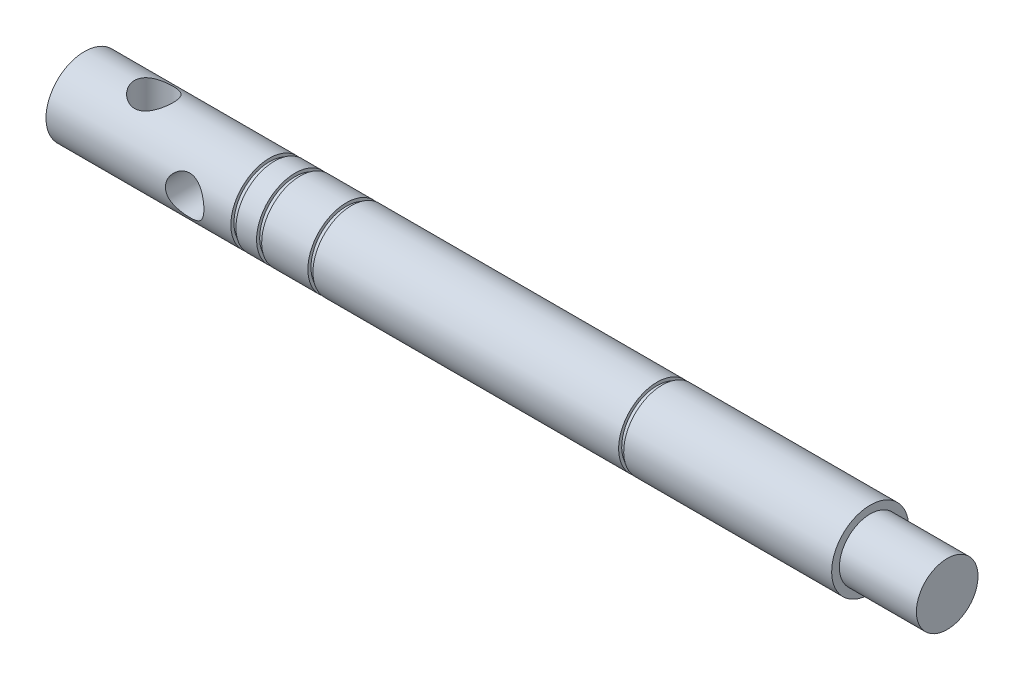
ISO-10303-21;
HEADER;
FILE_DESCRIPTION(('STEP AP214'),'2;1');
FILE_NAME('part.step','',(''),(''),'','','');
FILE_SCHEMA(('AUTOMOTIVE_DESIGN { 1 0 10303 214 1 1 1 1 }'));
ENDSEC;
DATA;
#1=APPLICATION_CONTEXT('core data for automotive mechanical design processes');
#2=APPLICATION_PROTOCOL_DEFINITION('international standard','automotive_design',2000,#1);
#3=PRODUCT_CONTEXT('',#1,'mechanical');
#4=PRODUCT('Part','Part','',(#3));
#5=PRODUCT_RELATED_PRODUCT_CATEGORY('part','',(#4));
#6=PRODUCT_DEFINITION_FORMATION('','',#4);
#7=PRODUCT_DEFINITION_CONTEXT('part definition',#1,'design');
#8=PRODUCT_DEFINITION('design','',#6,#7);
#9=PRODUCT_DEFINITION_SHAPE('','',#8);
#10=(LENGTH_UNIT() NAMED_UNIT(*) SI_UNIT(.MILLI.,.METRE.));
#11=(NAMED_UNIT(*) PLANE_ANGLE_UNIT() SI_UNIT($,.RADIAN.));
#12=(NAMED_UNIT(*) SI_UNIT($,.STERADIAN.) SOLID_ANGLE_UNIT());
#13=UNCERTAINTY_MEASURE_WITH_UNIT(LENGTH_MEASURE(1.E-05),#10,'distance_accuracy_value','');
#14=(GEOMETRIC_REPRESENTATION_CONTEXT(3) GLOBAL_UNCERTAINTY_ASSIGNED_CONTEXT((#13)) GLOBAL_UNIT_ASSIGNED_CONTEXT((#10,
#11,#12)) REPRESENTATION_CONTEXT('',''));
#15=CARTESIAN_POINT('',(0.,0.,0.));
#16=DIRECTION('',(0.,0.,1.));
#17=DIRECTION('',(1.,0.,0.));
#18=AXIS2_PLACEMENT_3D('',#15,#16,#17);
#19=CARTESIAN_POINT('',(0.,0.,0.));
#20=DIRECTION('',(1.,0.,0.));
#21=DIRECTION('',(0.,1.,0.));
#22=AXIS2_PLACEMENT_3D('',#19,#20,#21);
#23=PLANE('',#22);
#24=CARTESIAN_POINT('',(0.,0.,0.));
#25=DIRECTION('',(1.,0.,0.));
#26=DIRECTION('',(0.,1.,0.));
#27=AXIS2_PLACEMENT_3D('',#24,#25,#26);
#28=CIRCLE('',#27,4.);
#29=CARTESIAN_POINT('',(0.,4.,0.));
#30=VERTEX_POINT('',#29);
#31=EDGE_CURVE('E85',#30,#30,#28,.T.);
#32=ORIENTED_EDGE('',*,*,#31,.T.);
#33=EDGE_LOOP('',(#32));
#34=FACE_BOUND('',#33,.T.);
#35=ADVANCED_FACE('F37',(#34),#23,.T.);
#36=CARTESIAN_POINT('',(0.,0.,0.));
#37=DIRECTION('',(1.,0.,0.));
#38=DIRECTION('',(0.,1.,0.));
#39=AXIS2_PLACEMENT_3D('',#36,#37,#38);
#40=CYLINDRICAL_SURFACE('',#39,4.);
#41=CARTESIAN_POINT('',(-10.,0.,0.));
#42=DIRECTION('',(1.,0.,0.));
#43=DIRECTION('',(0.,1.,0.));
#44=AXIS2_PLACEMENT_3D('',#41,#42,#43);
#45=CIRCLE('',#44,4.);
#46=CARTESIAN_POINT('',(-10.,4.,0.));
#47=VERTEX_POINT('',#46);
#48=EDGE_CURVE('E88',#47,#47,#45,.T.);
#49=ORIENTED_EDGE('',*,*,#48,.T.);
#50=EDGE_LOOP('',(#49));
#51=FACE_BOUND('',#50,.T.);
#52=ORIENTED_EDGE('',*,*,#31,.F.);
#53=EDGE_LOOP('',(#52));
#54=FACE_BOUND('',#53,.T.);
#55=ADVANCED_FACE('F155',(#51,#54),#40,.T.);
#56=CARTESIAN_POINT('',(-10.,4.,0.));
#57=DIRECTION('',(1.,0.,0.));
#58=DIRECTION('',(0.,1.,0.));
#59=AXIS2_PLACEMENT_3D('',#56,#57,#58);
#60=PLANE('',#59);
#61=CARTESIAN_POINT('',(-10.,0.,0.));
#62=DIRECTION('',(1.,0.,0.));
#63=DIRECTION('',(0.,1.,0.));
#64=AXIS2_PLACEMENT_3D('',#61,#62,#63);
#65=CIRCLE('',#64,5.);
#66=CARTESIAN_POINT('',(-10.,5.,0.));
#67=VERTEX_POINT('',#66);
#68=EDGE_CURVE('E91',#67,#67,#65,.T.);
#69=ORIENTED_EDGE('',*,*,#68,.T.);
#70=EDGE_LOOP('',(#69));
#71=FACE_BOUND('',#70,.T.);
#72=ORIENTED_EDGE('',*,*,#48,.F.);
#73=EDGE_LOOP('',(#72));
#74=FACE_BOUND('',#73,.T.);
#75=ADVANCED_FACE('F160',(#71,#74),#60,.T.);
#76=CARTESIAN_POINT('',(0.,0.,0.));
#77=DIRECTION('',(1.,0.,0.));
#78=DIRECTION('',(0.,1.,0.));
#79=AXIS2_PLACEMENT_3D('',#76,#77,#78);
#80=CYLINDRICAL_SURFACE('',#79,5.);
#81=CARTESIAN_POINT('',(-37.,0.,0.));
#82=DIRECTION('',(1.,0.,0.));
#83=DIRECTION('',(0.,1.,0.));
#84=AXIS2_PLACEMENT_3D('',#81,#82,#83);
#85=CIRCLE('',#84,5.);
#86=CARTESIAN_POINT('',(-37.,5.,0.));
#87=VERTEX_POINT('',#86);
#88=EDGE_CURVE('E94',#87,#87,#85,.T.);
#89=ORIENTED_EDGE('',*,*,#88,.T.);
#90=EDGE_LOOP('',(#89));
#91=FACE_BOUND('',#90,.T.);
#92=ORIENTED_EDGE('',*,*,#68,.F.);
#93=EDGE_LOOP('',(#92));
#94=FACE_BOUND('',#93,.T.);
#95=ADVANCED_FACE('F167',(#91,#94),#80,.T.);
#96=CARTESIAN_POINT('',(-37.,5.,0.));
#97=DIRECTION('',(-1.,0.,0.));
#98=DIRECTION('',(0.,-1.,0.));
#99=AXIS2_PLACEMENT_3D('',#96,#97,#98);
#100=PLANE('',#99);
#101=CARTESIAN_POINT('',(-37.,0.,0.));
#102=DIRECTION('',(1.,0.,0.));
#103=DIRECTION('',(0.,1.,0.));
#104=AXIS2_PLACEMENT_3D('',#101,#102,#103);
#105=CIRCLE('',#104,4.6);
#106=CARTESIAN_POINT('',(-37.,4.59999999999999,0.));
#107=VERTEX_POINT('',#106);
#108=EDGE_CURVE('E97',#107,#107,#105,.T.);
#109=ORIENTED_EDGE('',*,*,#108,.T.);
#110=EDGE_LOOP('',(#109));
#111=FACE_BOUND('',#110,.T.);
#112=ORIENTED_EDGE('',*,*,#88,.F.);
#113=EDGE_LOOP('',(#112));
#114=FACE_BOUND('',#113,.T.);
#115=ADVANCED_FACE('F173',(#111,#114),#100,.T.);
#116=CARTESIAN_POINT('',(0.,0.,0.));
#117=DIRECTION('',(1.,0.,0.));
#118=DIRECTION('',(0.,1.,0.));
#119=AXIS2_PLACEMENT_3D('',#116,#117,#118);
#120=CYLINDRICAL_SURFACE('',#119,4.6);
#121=CARTESIAN_POINT('',(-37.66,0.,0.));
#122=DIRECTION('',(1.,0.,0.));
#123=DIRECTION('',(0.,1.,0.));
#124=AXIS2_PLACEMENT_3D('',#121,#122,#123);
#125=CIRCLE('',#124,4.6);
#126=CARTESIAN_POINT('',(-37.66,4.6,0.));
#127=VERTEX_POINT('',#126);
#128=EDGE_CURVE('E100',#127,#127,#125,.T.);
#129=ORIENTED_EDGE('',*,*,#128,.T.);
#130=EDGE_LOOP('',(#129));
#131=FACE_BOUND('',#130,.T.);
#132=ORIENTED_EDGE('',*,*,#108,.F.);
#133=EDGE_LOOP('',(#132));
#134=FACE_BOUND('',#133,.T.);
#135=ADVANCED_FACE('F177',(#131,#134),#120,.T.);
#136=CARTESIAN_POINT('',(-37.66,4.6,0.));
#137=DIRECTION('',(1.,0.,0.));
#138=DIRECTION('',(0.,1.,0.));
#139=AXIS2_PLACEMENT_3D('',#136,#137,#138);
#140=PLANE('',#139);
#141=CARTESIAN_POINT('',(-37.66,0.,0.));
#142=DIRECTION('',(1.,0.,0.));
#143=DIRECTION('',(0.,1.,0.));
#144=AXIS2_PLACEMENT_3D('',#141,#142,#143);
#145=CIRCLE('',#144,5.);
#146=CARTESIAN_POINT('',(-37.66,5.,0.));
#147=VERTEX_POINT('',#146);
#148=EDGE_CURVE('E103',#147,#147,#145,.T.);
#149=ORIENTED_EDGE('',*,*,#148,.T.);
#150=EDGE_LOOP('',(#149));
#151=FACE_BOUND('',#150,.T.);
#152=ORIENTED_EDGE('',*,*,#128,.F.);
#153=EDGE_LOOP('',(#152));
#154=FACE_BOUND('',#153,.T.);
#155=ADVANCED_FACE('F181',(#151,#154),#140,.T.);
#156=CARTESIAN_POINT('',(0.,0.,0.));
#157=DIRECTION('',(1.,0.,0.));
#158=DIRECTION('',(0.,1.,0.));
#159=AXIS2_PLACEMENT_3D('',#156,#157,#158);
#160=CYLINDRICAL_SURFACE('',#159,5.);
#161=CARTESIAN_POINT('',(-77.34,0.,0.));
#162=DIRECTION('',(1.,0.,0.));
#163=DIRECTION('',(0.,1.,0.));
#164=AXIS2_PLACEMENT_3D('',#161,#162,#163);
#165=CIRCLE('',#164,5.);
#166=CARTESIAN_POINT('',(-77.34,4.99999999999999,0.));
#167=VERTEX_POINT('',#166);
#168=EDGE_CURVE('E106',#167,#167,#165,.T.);
#169=ORIENTED_EDGE('',*,*,#168,.T.);
#170=EDGE_LOOP('',(#169));
#171=FACE_BOUND('',#170,.T.);
#172=ORIENTED_EDGE('',*,*,#148,.F.);
#173=EDGE_LOOP('',(#172));
#174=FACE_BOUND('',#173,.T.);
#175=ADVANCED_FACE('F185',(#171,#174),#160,.T.);
#176=CARTESIAN_POINT('',(-77.34,4.59999999999999,0.));
#177=DIRECTION('',(-1.,0.,0.));
#178=DIRECTION('',(0.,-1.,0.));
#179=AXIS2_PLACEMENT_3D('',#176,#177,#178);
#180=PLANE('',#179);
#181=CARTESIAN_POINT('',(-77.34,0.,0.));
#182=DIRECTION('',(1.,0.,0.));
#183=DIRECTION('',(0.,1.,0.));
#184=AXIS2_PLACEMENT_3D('',#181,#182,#183);
#185=CIRCLE('',#184,4.6);
#186=CARTESIAN_POINT('',(-77.34,4.59999999999999,0.));
#187=VERTEX_POINT('',#186);
#188=EDGE_CURVE('E109',#187,#187,#185,.T.);
#189=ORIENTED_EDGE('',*,*,#188,.T.);
#190=EDGE_LOOP('',(#189));
#191=FACE_BOUND('',#190,.T.);
#192=ORIENTED_EDGE('',*,*,#168,.F.);
#193=EDGE_LOOP('',(#192));
#194=FACE_BOUND('',#193,.T.);
#195=ADVANCED_FACE('F189',(#191,#194),#180,.T.);
#196=CARTESIAN_POINT('',(0.,0.,0.));
#197=DIRECTION('',(1.,0.,0.));
#198=DIRECTION('',(0.,1.,0.));
#199=AXIS2_PLACEMENT_3D('',#196,#197,#198);
#200=CYLINDRICAL_SURFACE('',#199,4.6);
#201=CARTESIAN_POINT('',(-78.,0.,0.));
#202=DIRECTION('',(1.,0.,0.));
#203=DIRECTION('',(0.,1.,0.));
#204=AXIS2_PLACEMENT_3D('',#201,#202,#203);
#205=CIRCLE('',#204,4.6);
#206=CARTESIAN_POINT('',(-78.,4.59999999999999,0.));
#207=VERTEX_POINT('',#206);
#208=EDGE_CURVE('E112',#207,#207,#205,.T.);
#209=ORIENTED_EDGE('',*,*,#208,.T.);
#210=EDGE_LOOP('',(#209));
#211=FACE_BOUND('',#210,.T.);
#212=ORIENTED_EDGE('',*,*,#188,.F.);
#213=EDGE_LOOP('',(#212));
#214=FACE_BOUND('',#213,.T.);
#215=ADVANCED_FACE('F193',(#211,#214),#200,.T.);
#216=CARTESIAN_POINT('',(-78.,4.99999999999999,0.));
#217=DIRECTION('',(1.,0.,0.));
#218=DIRECTION('',(0.,1.,0.));
#219=AXIS2_PLACEMENT_3D('',#216,#217,#218);
#220=PLANE('',#219);
#221=CARTESIAN_POINT('',(-78.,0.,0.));
#222=DIRECTION('',(1.,0.,0.));
#223=DIRECTION('',(0.,1.,0.));
#224=AXIS2_PLACEMENT_3D('',#221,#222,#223);
#225=CIRCLE('',#224,5.);
#226=CARTESIAN_POINT('',(-78.,4.99999999999999,0.));
#227=VERTEX_POINT('',#226);
#228=EDGE_CURVE('E115',#227,#227,#225,.T.);
#229=ORIENTED_EDGE('',*,*,#228,.T.);
#230=EDGE_LOOP('',(#229));
#231=FACE_BOUND('',#230,.T.);
#232=ORIENTED_EDGE('',*,*,#208,.F.);
#233=EDGE_LOOP('',(#232));
#234=FACE_BOUND('',#233,.T.);
#235=ADVANCED_FACE('F197',(#231,#234),#220,.T.);
#236=CARTESIAN_POINT('',(0.,0.,0.));
#237=DIRECTION('',(1.,0.,0.));
#238=DIRECTION('',(0.,1.,0.));
#239=AXIS2_PLACEMENT_3D('',#236,#237,#238);
#240=CYLINDRICAL_SURFACE('',#239,5.);
#241=CARTESIAN_POINT('',(-84.,0.,0.));
#242=DIRECTION('',(1.,0.,0.));
#243=DIRECTION('',(0.,1.,0.));
#244=AXIS2_PLACEMENT_3D('',#241,#242,#243);
#245=CIRCLE('',#244,5.);
#246=CARTESIAN_POINT('',(-84.,4.99999999999999,0.));
#247=VERTEX_POINT('',#246);
#248=EDGE_CURVE('E118',#247,#247,#245,.T.);
#249=ORIENTED_EDGE('',*,*,#248,.T.);
#250=EDGE_LOOP('',(#249));
#251=FACE_BOUND('',#250,.T.);
#252=ORIENTED_EDGE('',*,*,#228,.F.);
#253=EDGE_LOOP('',(#252));
#254=FACE_BOUND('',#253,.T.);
#255=ADVANCED_FACE('F201',(#251,#254),#240,.T.);
#256=CARTESIAN_POINT('',(-84.,4.99999999999999,0.));
#257=DIRECTION('',(-1.,0.,0.));
#258=DIRECTION('',(0.,-1.,0.));
#259=AXIS2_PLACEMENT_3D('',#256,#257,#258);
#260=PLANE('',#259);
#261=CARTESIAN_POINT('',(-84.,0.,0.));
#262=DIRECTION('',(1.,0.,0.));
#263=DIRECTION('',(0.,1.,0.));
#264=AXIS2_PLACEMENT_3D('',#261,#262,#263);
#265=CIRCLE('',#264,4.60000000000003);
#266=CARTESIAN_POINT('',(-84.,4.60000000000002,0.));
#267=VERTEX_POINT('',#266);
#268=EDGE_CURVE('E121',#267,#267,#265,.T.);
#269=ORIENTED_EDGE('',*,*,#268,.T.);
#270=EDGE_LOOP('',(#269));
#271=FACE_BOUND('',#270,.T.);
#272=ORIENTED_EDGE('',*,*,#248,.F.);
#273=EDGE_LOOP('',(#272));
#274=FACE_BOUND('',#273,.T.);
#275=ADVANCED_FACE('F205',(#271,#274),#260,.T.);
#276=CARTESIAN_POINT('',(0.,0.,0.));
#277=DIRECTION('',(1.,0.,0.));
#278=DIRECTION('',(0.,1.,0.));
#279=AXIS2_PLACEMENT_3D('',#276,#277,#278);
#280=CYLINDRICAL_SURFACE('',#279,4.60000000000003);
#281=CARTESIAN_POINT('',(-84.66,0.,0.));
#282=DIRECTION('',(1.,0.,0.));
#283=DIRECTION('',(0.,1.,0.));
#284=AXIS2_PLACEMENT_3D('',#281,#282,#283);
#285=CIRCLE('',#284,4.60000000000003);
#286=CARTESIAN_POINT('',(-84.66,4.60000000000002,0.));
#287=VERTEX_POINT('',#286);
#288=EDGE_CURVE('E124',#287,#287,#285,.T.);
#289=ORIENTED_EDGE('',*,*,#288,.T.);
#290=EDGE_LOOP('',(#289));
#291=FACE_BOUND('',#290,.T.);
#292=ORIENTED_EDGE('',*,*,#268,.F.);
#293=EDGE_LOOP('',(#292));
#294=FACE_BOUND('',#293,.T.);
#295=ADVANCED_FACE('F209',(#291,#294),#280,.T.);
#296=CARTESIAN_POINT('',(-84.66,4.60000000000002,0.));
#297=DIRECTION('',(1.,0.,0.));
#298=DIRECTION('',(0.,1.,0.));
#299=AXIS2_PLACEMENT_3D('',#296,#297,#298);
#300=PLANE('',#299);
#301=CARTESIAN_POINT('',(-84.66,0.,0.));
#302=DIRECTION('',(1.,0.,0.));
#303=DIRECTION('',(0.,1.,0.));
#304=AXIS2_PLACEMENT_3D('',#301,#302,#303);
#305=CIRCLE('',#304,5.00000000000003);
#306=CARTESIAN_POINT('',(-84.66,5.00000000000002,0.));
#307=VERTEX_POINT('',#306);
#308=EDGE_CURVE('E127',#307,#307,#305,.T.);
#309=ORIENTED_EDGE('',*,*,#308,.T.);
#310=EDGE_LOOP('',(#309));
#311=FACE_BOUND('',#310,.T.);
#312=ORIENTED_EDGE('',*,*,#288,.F.);
#313=EDGE_LOOP('',(#312));
#314=FACE_BOUND('',#313,.T.);
#315=ADVANCED_FACE('F213',(#311,#314),#300,.T.);
#316=CARTESIAN_POINT('',(0.,0.,0.));
#317=DIRECTION('',(1.,0.,0.));
#318=DIRECTION('',(0.,1.,0.));
#319=AXIS2_PLACEMENT_3D('',#316,#317,#318);
#320=CYLINDRICAL_SURFACE('',#319,5.00000000000003);
#321=CARTESIAN_POINT('',(-87.34,0.,0.));
#322=DIRECTION('',(1.,0.,0.));
#323=DIRECTION('',(0.,1.,0.));
#324=AXIS2_PLACEMENT_3D('',#321,#322,#323);
#325=CIRCLE('',#324,5.00000000000003);
#326=CARTESIAN_POINT('',(-87.34,5.00000000000002,0.));
#327=VERTEX_POINT('',#326);
#328=EDGE_CURVE('E130',#327,#327,#325,.T.);
#329=ORIENTED_EDGE('',*,*,#328,.T.);
#330=EDGE_LOOP('',(#329));
#331=FACE_BOUND('',#330,.T.);
#332=ORIENTED_EDGE('',*,*,#308,.F.);
#333=EDGE_LOOP('',(#332));
#334=FACE_BOUND('',#333,.T.);
#335=ADVANCED_FACE('F217',(#331,#334),#320,.T.);
#336=CARTESIAN_POINT('',(-87.34,5.00000000000002,0.));
#337=DIRECTION('',(-1.,0.,0.));
#338=DIRECTION('',(0.,-1.,0.));
#339=AXIS2_PLACEMENT_3D('',#336,#337,#338);
#340=PLANE('',#339);
#341=CARTESIAN_POINT('',(-87.34,0.,0.));
#342=DIRECTION('',(1.,0.,0.));
#343=DIRECTION('',(0.,1.,0.));
#344=AXIS2_PLACEMENT_3D('',#341,#342,#343);
#345=CIRCLE('',#344,4.60000000000002);
#346=CARTESIAN_POINT('',(-87.34,4.60000000000001,0.));
#347=VERTEX_POINT('',#346);
#348=EDGE_CURVE('E133',#347,#347,#345,.T.);
#349=ORIENTED_EDGE('',*,*,#348,.T.);
#350=EDGE_LOOP('',(#349));
#351=FACE_BOUND('',#350,.T.);
#352=ORIENTED_EDGE('',*,*,#328,.F.);
#353=EDGE_LOOP('',(#352));
#354=FACE_BOUND('',#353,.T.);
#355=ADVANCED_FACE('F221',(#351,#354),#340,.T.);
#356=CARTESIAN_POINT('',(0.,0.,0.));
#357=DIRECTION('',(1.,0.,0.));
#358=DIRECTION('',(0.,1.,0.));
#359=AXIS2_PLACEMENT_3D('',#356,#357,#358);
#360=CYLINDRICAL_SURFACE('',#359,4.60000000000002);
#361=CARTESIAN_POINT('',(-88.,0.,0.));
#362=DIRECTION('',(1.,0.,0.));
#363=DIRECTION('',(0.,1.,0.));
#364=AXIS2_PLACEMENT_3D('',#361,#362,#363);
#365=CIRCLE('',#364,4.60000000000002);
#366=CARTESIAN_POINT('',(-88.,4.60000000000001,0.));
#367=VERTEX_POINT('',#366);
#368=EDGE_CURVE('E136',#367,#367,#365,.T.);
#369=ORIENTED_EDGE('',*,*,#368,.T.);
#370=EDGE_LOOP('',(#369));
#371=FACE_BOUND('',#370,.T.);
#372=ORIENTED_EDGE('',*,*,#348,.F.);
#373=EDGE_LOOP('',(#372));
#374=FACE_BOUND('',#373,.T.);
#375=ADVANCED_FACE('F225',(#371,#374),#360,.T.);
#376=CARTESIAN_POINT('',(-88.,4.60000000000001,0.));
#377=DIRECTION('',(1.,0.,0.));
#378=DIRECTION('',(0.,1.,0.));
#379=AXIS2_PLACEMENT_3D('',#376,#377,#378);
#380=PLANE('',#379);
#381=CARTESIAN_POINT('',(-88.,0.,0.));
#382=DIRECTION('',(1.,0.,0.));
#383=DIRECTION('',(0.,1.,0.));
#384=AXIS2_PLACEMENT_3D('',#381,#382,#383);
#385=CIRCLE('',#384,5.00000000000003);
#386=CARTESIAN_POINT('',(-88.,5.00000000000002,0.));
#387=VERTEX_POINT('',#386);
#388=EDGE_CURVE('E139',#387,#387,#385,.T.);
#389=ORIENTED_EDGE('',*,*,#388,.T.);
#390=EDGE_LOOP('',(#389));
#391=FACE_BOUND('',#390,.T.);
#392=ORIENTED_EDGE('',*,*,#368,.F.);
#393=EDGE_LOOP('',(#392));
#394=FACE_BOUND('',#393,.T.);
#395=ADVANCED_FACE('F152',(#391,#394),#380,.T.);
#396=CARTESIAN_POINT('',(0.,0.,0.));
#397=DIRECTION('',(1.,0.,0.));
#398=DIRECTION('',(0.,1.,0.));
#399=AXIS2_PLACEMENT_3D('',#396,#397,#398);
#400=CYLINDRICAL_SURFACE('',#399,5.00000000000003);
#401=CARTESIAN_POINT('',(-91.5,0.,-5.00000000000003));
#402=CARTESIAN_POINT('',(-91.500009669056,-0.131426682334305,-4.99999177550475));
#403=CARTESIAN_POINT('',(-91.5104255617741,-0.263015634437214,-4.9947619913528));
#404=CARTESIAN_POINT('',(-91.5516318211621,-0.522301454622884,-4.97435418561023));
#405=CARTESIAN_POINT('',(-91.582460880925,-0.649990448564105,-4.95915727187673));
#406=CARTESIAN_POINT('',(-91.6629846227189,-0.897333631316201,-4.9204069092248));
#407=CARTESIAN_POINT('',(-91.7126059877828,-1.01701694536277,-4.89688595907263));
#408=CARTESIAN_POINT('',(-91.8289265262518,-1.2461816039967,-4.84364443325831));
#409=CARTESIAN_POINT('',(-91.8956243531451,-1.3556637520377,-4.81392434644424));
#410=CARTESIAN_POINT('',(-92.0487931316426,-1.56876952630998,-4.74890645050635));
#411=CARTESIAN_POINT('',(-92.1362162002298,-1.67163802294308,-4.71337997659094));
#412=CARTESIAN_POINT('',(-92.3263036959853,-1.86194861703332,-4.64149925776735));
#413=CARTESIAN_POINT('',(-92.4289796288401,-1.94937895911555,-4.60514440566901));
#414=CARTESIAN_POINT('',(-92.6562083744453,-2.11312999967247,-4.53247377945625));
#415=CARTESIAN_POINT('',(-92.781840246035,-2.18806333849064,-4.49637967412571));
#416=CARTESIAN_POINT('',(-93.0459183397955,-2.31542056761491,-4.43214946943559));
#417=CARTESIAN_POINT('',(-93.1843553217626,-2.36786053751682,-4.40400769020796));
#418=CARTESIAN_POINT('',(-93.4616627635964,-2.44533110537652,-4.36144667591406));
#419=CARTESIAN_POINT('',(-93.6000111301796,-2.47181464267578,-4.34630678958456));
#420=CARTESIAN_POINT('',(-93.8799470944376,-2.5010674832974,-4.32954724872155));
#421=CARTESIAN_POINT('',(-94.0215313521751,-2.50386022093906,-4.32791423358434));
#422=CARTESIAN_POINT('',(-94.2857150607909,-2.48671821792512,-4.33777325642941));
#423=CARTESIAN_POINT('',(-94.4085600780583,-2.46946139884054,-4.34771909154989));
#424=CARTESIAN_POINT('',(-94.649304773432,-2.41734962264383,-4.3769057183468));
#425=CARTESIAN_POINT('',(-94.7672028632631,-2.38248905974453,-4.39614947079459));
#426=CARTESIAN_POINT('',(-94.9980728314143,-2.29552445096459,-4.44218691031843));
#427=CARTESIAN_POINT('',(-95.1108659969645,-2.24303766778987,-4.46914601659997));
#428=CARTESIAN_POINT('',(-95.326585731475,-2.12260421917012,-4.52758510703517));
#429=CARTESIAN_POINT('',(-95.4295078390002,-2.0546506095312,-4.55906711950482));
#430=CARTESIAN_POINT('',(-95.6363031318581,-1.89516513728193,-4.62782894758217));
#431=CARTESIAN_POINT('',(-95.7386421839404,-1.80173614592319,-4.66533775591869));
#432=CARTESIAN_POINT('',(-95.9268385464773,-1.59888894685344,-4.73869058251022));
#433=CARTESIAN_POINT('',(-96.0126879800847,-1.48946314143571,-4.77453379897007));
#434=CARTESIAN_POINT('',(-96.1692141525743,-1.25129126457961,-4.84254968207412));
#435=CARTESIAN_POINT('',(-96.2390011811144,-1.12188397899852,-4.87447460405019));
#436=CARTESIAN_POINT('',(-96.3552425726075,-0.851165538721969,-4.92894702803112));
#437=CARTESIAN_POINT('',(-96.4017154625379,-0.709863940663145,-4.95150197358897));
#438=CARTESIAN_POINT('',(-96.4661885092917,-0.431916229151763,-4.98310834353582));
#439=CARTESIAN_POINT('',(-96.486228089367,-0.295853826370888,-4.99312345753243));
#440=CARTESIAN_POINT('',(-96.5036618278362,-0.0219489998732725,-5.00182533647797));
#441=CARTESIAN_POINT('',(-96.5010667140985,0.115892549675123,-5.00051746803429));
#442=CARTESIAN_POINT('',(-96.4744832789533,0.378082429964669,-4.98727980633471));
#443=CARTESIAN_POINT('',(-96.4521686681756,0.502648520123719,-4.97618114219995));
#444=CARTESIAN_POINT('',(-96.3894048202616,0.746017230755982,-4.94555428287532));
#445=CARTESIAN_POINT('',(-96.3489535838641,0.864819214231891,-4.92602515837627));
#446=CARTESIAN_POINT('',(-96.2500038339196,1.09722152111965,-4.87960628532332));
#447=CARTESIAN_POINT('',(-96.1910223747177,1.21057599249831,-4.85252204417876));
#448=CARTESIAN_POINT('',(-96.0572311608752,1.42615340426439,-4.79359935799753));
#449=CARTESIAN_POINT('',(-95.9824146634801,1.52837157450204,-4.76175888940537));
#450=CARTESIAN_POINT('',(-95.8105989367091,1.72941922315487,-4.69270553315089));
#451=CARTESIAN_POINT('',(-95.7121428290248,1.82693019428496,-4.65527212009491));
#452=CARTESIAN_POINT('',(-95.5001871219506,2.0046408025722,-4.5815597892159));
#453=CARTESIAN_POINT('',(-95.3866772029301,2.08482846428685,-4.5452816847241));
#454=CARTESIAN_POINT('',(-95.1408908645154,2.22926978618995,-4.47627980545283));
#455=CARTESIAN_POINT('',(-95.0079718347089,2.29256373922243,-4.44381323981257));
#456=CARTESIAN_POINT('',(-94.7312248311175,2.39520706511458,-4.38935180726749));
#457=CARTESIAN_POINT('',(-94.587411184,2.43458729077055,-4.36734345549017));
#458=CARTESIAN_POINT('',(-94.3077244426371,2.48465421767005,-4.33903752569354));
#459=CARTESIAN_POINT('',(-94.172414365881,2.4977324874436,-4.33143458674099));
#460=CARTESIAN_POINT('',(-93.9013823326193,2.50172288950898,-4.32913386592582));
#461=CARTESIAN_POINT('',(-93.7656605801264,2.49264462983265,-4.33443049025114));
#462=CARTESIAN_POINT('',(-93.5112912443831,2.45481530197331,-4.35594655164666));
#463=CARTESIAN_POINT('',(-93.3922488182792,2.42802074302695,-4.37107736338136));
#464=CARTESIAN_POINT('',(-93.1604797078,2.35793843840542,-4.40927540337606));
#465=CARTESIAN_POINT('',(-93.0477550684334,2.31464538728731,-4.43234518434969));
#466=CARTESIAN_POINT('',(-92.8234378472803,2.20953919315536,-4.48571326433416));
#467=CARTESIAN_POINT('',(-92.712430148265,2.14667719009402,-4.51639307998453));
#468=CARTESIAN_POINT('',(-92.5018137567599,2.00537808387988,-4.58088327077459));
#469=CARTESIAN_POINT('',(-92.4022110373713,1.92693287765887,-4.6146952697077));
#470=CARTESIAN_POINT('',(-92.2046446362504,1.74550556946064,-4.68655816327014));
#471=CARTESIAN_POINT('',(-92.1083506358286,1.64070022469208,-4.72462491514984));
#472=CARTESIAN_POINT('',(-91.934344150572,1.41539785420682,-4.79694347383548));
#473=CARTESIAN_POINT('',(-91.8566416813941,1.29489242426331,-4.8311932190545));
#474=CARTESIAN_POINT('',(-91.7219030205159,1.03978808878534,-4.89245149457785));
#475=CARTESIAN_POINT('',(-91.6650168322156,0.905095560782268,-4.91940711437491));
#476=CARTESIAN_POINT('',(-91.5978161412076,0.696328709257332,-4.95177960923354));
#477=CARTESIAN_POINT('',(-91.5784446019982,0.625670413494069,-4.96122314081877));
#478=CARTESIAN_POINT('',(-91.5459340516294,0.482623997839239,-4.97717127275104));
#479=CARTESIAN_POINT('',(-91.5327912333237,0.410236963092383,-4.98367766823162));
#480=CARTESIAN_POINT('',(-91.5152625277154,0.281518684621656,-4.99238200766133));
#481=CARTESIAN_POINT('',(-91.5095450634687,0.225408499555433,-4.99523288466457));
#482=CARTESIAN_POINT('',(-91.5019116705343,0.112875528456283,-4.99904367329662));
#483=CARTESIAN_POINT('',(-91.4999958467746,0.0564527338382152,-5.00000353273201));
#484=CARTESIAN_POINT('',(-91.5,0.,-5.00000000000003));
#485=B_SPLINE_CURVE_WITH_KNOTS('',3,(#401,#402,#403,#404,#405,#406,#407,#408,#409,#410,#411,
#412,#413,#414,#415,#416,#417,#418,#419,#420,#421,#422,#423,#424,#425,#426,#427,#428,#429,#430,
#431,#432,#433,#434,#435,#436,#437,#438,#439,#440,#441,#442,#443,#444,#445,#446,#447,#448,#449,
#450,#451,#452,#453,#454,#455,#456,#457,#458,#459,#460,#461,#462,#463,#464,#465,#466,#467,#468,
#469,#470,#471,#472,#473,#474,#475,#476,#477,#478,#479,#480,#481,#482,#483,#484),.UNSPECIFIED.,
.T.,.F.,(4,2,2,2,2,2,2,2,2,2,2,2,2,2,2,2,2,2,2,2,2,2,2,2,2,2,2,2,2,2,2,2,2,2,2,2,2,2,2,2,2,4),
(0.,0.394060643550731,0.788870374272994,1.18215538873075,1.57540940145391,1.99245439679522,
2.40981559413508,2.85954316076882,3.30894869745702,3.73145030350572,4.1535339332255,
4.525142810233,4.89687009814194,5.27725600421217,5.65781303150553,6.08662353334694,
6.51563836496714,6.96457555536101,7.41315542280699,7.82458226178364,8.23581411278689,
8.61517266265304,8.99457304077327,9.38482140069745,9.77523626870847,10.2039902661037,
10.6330397153795,11.0828670540368,11.5321127986299,11.9382326875698,12.3441764966106,
12.7114482562151,13.0788382197025,13.4709114195009,13.8631890285844,14.303131068923,
14.7433095845248,15.1866003415818,15.407934939208,15.6291340766843,15.7983933645035,
15.9676573239322),.UNSPECIFIED.);
#486=CARTESIAN_POINT('',(-91.5,0.,-5.00000000000003));
#487=VERTEX_POINT('',#486);
#488=EDGE_CURVE('E10',#487,#487,#485,.T.);
#489=ORIENTED_EDGE('',*,*,#488,.F.);
#490=EDGE_LOOP('',(#489));
#491=FACE_BOUND('',#490,.T.);
#492=CARTESIAN_POINT('',(-91.5,0.,5.00000000000003));
#493=CARTESIAN_POINT('',(-91.500009669056,0.131426682334293,4.99999177550475));
#494=CARTESIAN_POINT('',(-91.5104255617741,0.263015634437201,4.9947619913528));
#495=CARTESIAN_POINT('',(-91.5516318211621,0.522301454622871,4.97435418561023));
#496=CARTESIAN_POINT('',(-91.582460880925,0.649990448564093,4.95915727187673));
#497=CARTESIAN_POINT('',(-91.6629846227189,0.897333631316191,4.9204069092248));
#498=CARTESIAN_POINT('',(-91.7126059877827,1.01701694536276,4.89688595907262));
#499=CARTESIAN_POINT('',(-91.8289265262518,1.2461816039967,4.8436444332583));
#500=CARTESIAN_POINT('',(-91.8956243531451,1.35566375203769,4.81392434644424));
#501=CARTESIAN_POINT('',(-92.0487931316426,1.56876952630997,4.74890645050635));
#502=CARTESIAN_POINT('',(-92.1362162002298,1.67163802294307,4.71337997659094));
#503=CARTESIAN_POINT('',(-92.3263036959853,1.86194861703331,4.64149925776734));
#504=CARTESIAN_POINT('',(-92.4289796288401,1.94937895911554,4.60514440566901));
#505=CARTESIAN_POINT('',(-92.6562083744453,2.11312999967246,4.53247377945625));
#506=CARTESIAN_POINT('',(-92.781840246035,2.18806333849063,4.4963796741257));
#507=CARTESIAN_POINT('',(-93.0459183397954,2.3154205676149,4.43214946943558));
#508=CARTESIAN_POINT('',(-93.1843553217626,2.36786053751682,4.40400769020795));
#509=CARTESIAN_POINT('',(-93.4616627635964,2.44533110537652,4.36144667591405));
#510=CARTESIAN_POINT('',(-93.6000111301796,2.47181464267577,4.34630678958455));
#511=CARTESIAN_POINT('',(-93.8799470944376,2.5010674832974,4.32954724872154));
#512=CARTESIAN_POINT('',(-94.0215313521751,2.50386022093906,4.32791423358433));
#513=CARTESIAN_POINT('',(-94.2857150607909,2.48671821792512,4.3377732564294));
#514=CARTESIAN_POINT('',(-94.4085600780583,2.46946139884054,4.34771909154987));
#515=CARTESIAN_POINT('',(-94.6493047734319,2.41734962264384,4.37690571834678));
#516=CARTESIAN_POINT('',(-94.7672028632631,2.38248905974454,4.39614947079457));
#517=CARTESIAN_POINT('',(-94.9980728314143,2.29552445096459,4.44218691031841));
#518=CARTESIAN_POINT('',(-95.1108659969645,2.24303766778988,4.46914601659995));
#519=CARTESIAN_POINT('',(-95.326585731475,2.12260421917012,4.52758510703516));
#520=CARTESIAN_POINT('',(-95.4295078390002,2.0546506095312,4.5590671195048));
#521=CARTESIAN_POINT('',(-95.6363031318581,1.89516513728194,4.62782894758216));
#522=CARTESIAN_POINT('',(-95.7386421839404,1.8017361459232,4.66533775591867));
#523=CARTESIAN_POINT('',(-95.9268385464772,1.59888894685345,4.73869058251021));
#524=CARTESIAN_POINT('',(-96.0126879800847,1.48946314143573,4.77453379897005));
#525=CARTESIAN_POINT('',(-96.1692141525743,1.25129126457963,4.84254968207411));
#526=CARTESIAN_POINT('',(-96.2390011811143,1.12188397899854,4.87447460405018));
#527=CARTESIAN_POINT('',(-96.3552425726075,0.851165538722002,4.92894702803111));
#528=CARTESIAN_POINT('',(-96.4017154625379,0.709863940663179,4.95150197358896));
#529=CARTESIAN_POINT('',(-96.4661885092917,0.431916229151795,4.98310834353582));
#530=CARTESIAN_POINT('',(-96.486228089367,0.29585382637092,4.99312345753243));
#531=CARTESIAN_POINT('',(-96.5036618278362,0.0219489998732997,5.00182533647797));
#532=CARTESIAN_POINT('',(-96.5010667140985,-0.115892549675099,5.00051746803429));
#533=CARTESIAN_POINT('',(-96.4744832789533,-0.378082429964647,4.98727980633471));
#534=CARTESIAN_POINT('',(-96.4521686681756,-0.502648520123696,4.97618114219996));
#535=CARTESIAN_POINT('',(-96.3894048202616,-0.746017230755962,4.94555428287533));
#536=CARTESIAN_POINT('',(-96.3489535838641,-0.864819214231874,4.92602515837628));
#537=CARTESIAN_POINT('',(-96.2500038339196,-1.09722152111964,4.87960628532332));
#538=CARTESIAN_POINT('',(-96.1910223747177,-1.2105759924983,4.85252204417877));
#539=CARTESIAN_POINT('',(-96.0572311608752,-1.42615340426438,4.79359935799754));
#540=CARTESIAN_POINT('',(-95.9824146634801,-1.52837157450203,4.76175888940538));
#541=CARTESIAN_POINT('',(-95.8105989367091,-1.72941922315487,4.6927055331509));
#542=CARTESIAN_POINT('',(-95.7121428290248,-1.82693019428496,4.65527212009492));
#543=CARTESIAN_POINT('',(-95.5001871219506,-2.00464080257219,4.58155978921591));
#544=CARTESIAN_POINT('',(-95.3866772029301,-2.08482846428684,4.54528168472411));
#545=CARTESIAN_POINT('',(-95.1408908645154,-2.22926978618994,4.47627980545284));
#546=CARTESIAN_POINT('',(-95.0079718347089,-2.29256373922243,4.44381323981258));
#547=CARTESIAN_POINT('',(-94.7312248311175,-2.39520706511458,4.3893518072675));
#548=CARTESIAN_POINT('',(-94.587411184,-2.43458729077055,4.36734345549018));
#549=CARTESIAN_POINT('',(-94.3077244426371,-2.48465421767005,4.33903752569356));
#550=CARTESIAN_POINT('',(-94.172414365881,-2.4977324874436,4.33143458674101));
#551=CARTESIAN_POINT('',(-93.9013823326193,-2.50172288950898,4.32913386592583));
#552=CARTESIAN_POINT('',(-93.7656605801264,-2.49264462983265,4.33443049025115));
#553=CARTESIAN_POINT('',(-93.5112912443832,-2.45481530197331,4.35594655164667));
#554=CARTESIAN_POINT('',(-93.3922488182793,-2.42802074302695,4.37107736338137));
#555=CARTESIAN_POINT('',(-93.1604797078001,-2.35793843840543,4.40927540337607));
#556=CARTESIAN_POINT('',(-93.0477550684335,-2.31464538728732,4.4323451843497));
#557=CARTESIAN_POINT('',(-92.8234378472803,-2.20953919315537,4.48571326433417));
#558=CARTESIAN_POINT('',(-92.712430148265,-2.14667719009403,4.51639307998454));
#559=CARTESIAN_POINT('',(-92.50181375676,-2.00537808387989,4.58088327077459));
#560=CARTESIAN_POINT('',(-92.4022110373713,-1.92693287765888,4.6146952697077));
#561=CARTESIAN_POINT('',(-92.2046446362504,-1.74550556946066,4.68655816327014));
#562=CARTESIAN_POINT('',(-92.1083506358286,-1.6407002246921,4.72462491514984));
#563=CARTESIAN_POINT('',(-91.934344150572,-1.41539785420684,4.79694347383549));
#564=CARTESIAN_POINT('',(-91.8566416813941,-1.29489242426332,4.8311932190545));
#565=CARTESIAN_POINT('',(-91.7219030205159,-1.03978808878536,4.89245149457785));
#566=CARTESIAN_POINT('',(-91.6650168322156,-0.905095560782286,4.91940711437492));
#567=CARTESIAN_POINT('',(-91.5978161412076,-0.696328709257351,4.95177960923354));
#568=CARTESIAN_POINT('',(-91.5784446019982,-0.625670413494088,4.96122314081877));
#569=CARTESIAN_POINT('',(-91.5459340516294,-0.482623997839258,4.97717127275104));
#570=CARTESIAN_POINT('',(-91.5327912333237,-0.410236963092403,4.98367766823162));
#571=CARTESIAN_POINT('',(-91.5152625277154,-0.281518684621675,4.99238200766133));
#572=CARTESIAN_POINT('',(-91.5095450634687,-0.225408499555451,4.99523288466457));
#573=CARTESIAN_POINT('',(-91.5019116705343,-0.112875528456298,4.99904367329662));
#574=CARTESIAN_POINT('',(-91.4999958467746,-0.0564527338382282,5.00000353273201));
#575=CARTESIAN_POINT('',(-91.5,0.,5.00000000000003));
#576=B_SPLINE_CURVE_WITH_KNOTS('',3,(#492,#493,#494,#495,#496,#497,#498,#499,#500,#501,#502,
#503,#504,#505,#506,#507,#508,#509,#510,#511,#512,#513,#514,#515,#516,#517,#518,#519,#520,#521,
#522,#523,#524,#525,#526,#527,#528,#529,#530,#531,#532,#533,#534,#535,#536,#537,#538,#539,#540,
#541,#542,#543,#544,#545,#546,#547,#548,#549,#550,#551,#552,#553,#554,#555,#556,#557,#558,#559,
#560,#561,#562,#563,#564,#565,#566,#567,#568,#569,#570,#571,#572,#573,#574,#575),.UNSPECIFIED.,
.T.,.F.,(4,2,2,2,2,2,2,2,2,2,2,2,2,2,2,2,2,2,2,2,2,2,2,2,2,2,2,2,2,2,2,2,2,2,2,2,2,2,2,2,2,4),
(0.,0.39406064355073,0.788870374272991,1.18215538873074,1.57540940145392,1.99245439679523,
2.40981559413508,2.85954316076881,3.30894869745702,3.73145030350574,4.1535339332255,
4.525142810233,4.89687009814193,5.27725600421217,5.65781303150552,6.08662353334694,
6.51563836496713,6.96457555536099,7.41315542280696,7.82458226178362,8.23581411278688,
8.61517266265303,8.99457304077326,9.38482140069745,9.77523626870846,10.2039902661037,
10.6330397153795,11.0828670540368,11.5321127986299,11.9382326875698,12.3441764966106,
12.7114482562151,13.0788382197025,13.4709114195008,13.8631890285844,14.3031310689229,
14.7433095845248,15.1866003415818,15.4079349392079,15.6291340766843,15.7983933645035,
15.9676573239322),.UNSPECIFIED.);
#577=CARTESIAN_POINT('',(-91.5,0.,5.00000000000003));
#578=VERTEX_POINT('',#577);
#579=EDGE_CURVE('E48',#578,#578,#576,.T.);
#580=ORIENTED_EDGE('',*,*,#579,.F.);
#581=EDGE_LOOP('',(#580));
#582=FACE_BOUND('',#581,.T.);
#583=CARTESIAN_POINT('',(-100.5,-5.00000000000005,0.));
#584=CARTESIAN_POINT('',(-100.500009669056,-4.99999177550476,0.131426682334305));
#585=CARTESIAN_POINT('',(-100.510425561774,-4.99476199135282,0.263015634437213));
#586=CARTESIAN_POINT('',(-100.551631821162,-4.97435418561024,0.522301454622882));
#587=CARTESIAN_POINT('',(-100.582460880925,-4.95915727187675,0.649990448564104));
#588=CARTESIAN_POINT('',(-100.662984622719,-4.92040690922481,0.8973336313162));
#589=CARTESIAN_POINT('',(-100.712605987783,-4.89688595907264,1.01701694536276));
#590=CARTESIAN_POINT('',(-100.828926526252,-4.84364443325832,1.2461816039967));
#591=CARTESIAN_POINT('',(-100.895624353145,-4.81392434644425,1.3556637520377));
#592=CARTESIAN_POINT('',(-101.048793131643,-4.74890645050636,1.56876952630997));
#593=CARTESIAN_POINT('',(-101.13621620023,-4.71337997659095,1.67163802294308));
#594=CARTESIAN_POINT('',(-101.326303695985,-4.64149925776736,1.86194861703332));
#595=CARTESIAN_POINT('',(-101.42897962884,-4.60514440566902,1.94937895911555));
#596=CARTESIAN_POINT('',(-101.656208374445,-4.53247377945626,2.11312999967247));
#597=CARTESIAN_POINT('',(-101.781840246035,-4.49637967412571,2.18806333849064));
#598=CARTESIAN_POINT('',(-102.045918339795,-4.4321494694356,2.31542056761491));
#599=CARTESIAN_POINT('',(-102.184355321763,-4.40400769020797,2.36786053751682));
#600=CARTESIAN_POINT('',(-102.461662763596,-4.36144667591407,2.44533110537652));
#601=CARTESIAN_POINT('',(-102.60001113018,-4.34630678958457,2.47181464267578));
#602=CARTESIAN_POINT('',(-102.879947094438,-4.32954724872155,2.50106748329741));
#603=CARTESIAN_POINT('',(-103.021531352175,-4.32791423358435,2.50386022093906));
#604=CARTESIAN_POINT('',(-103.285715060791,-4.33777325642942,2.48671821792512));
#605=CARTESIAN_POINT('',(-103.408560078058,-4.3477190915499,2.46946139884054));
#606=CARTESIAN_POINT('',(-103.649304773432,-4.3769057183468,2.41734962264383));
#607=CARTESIAN_POINT('',(-103.767202863263,-4.39614947079459,2.38248905974453));
#608=CARTESIAN_POINT('',(-103.998072831414,-4.44218691031844,2.29552445096459));
#609=CARTESIAN_POINT('',(-104.110865996965,-4.46914601659998,2.24303766778987));
#610=CARTESIAN_POINT('',(-104.326585731475,-4.52758510703518,2.12260421917011));
#611=CARTESIAN_POINT('',(-104.429507839,-4.55906711950482,2.0546506095312));
#612=CARTESIAN_POINT('',(-104.636303131858,-4.62782894758218,1.89516513728193));
#613=CARTESIAN_POINT('',(-104.73864218394,-4.66533775591869,1.80173614592319));
#614=CARTESIAN_POINT('',(-104.926838546477,-4.73869058251023,1.59888894685344));
#615=CARTESIAN_POINT('',(-105.012687980085,-4.77453379897008,1.48946314143571));
#616=CARTESIAN_POINT('',(-105.169214152574,-4.84254968207413,1.25129126457961));
#617=CARTESIAN_POINT('',(-105.239001181114,-4.8744746040502,1.12188397899852));
#618=CARTESIAN_POINT('',(-105.355242572608,-4.92894702803113,0.851165538721975));
#619=CARTESIAN_POINT('',(-105.401715462538,-4.95150197358898,0.70986394066315));
#620=CARTESIAN_POINT('',(-105.466188509292,-4.98310834353584,0.431916229151765));
#621=CARTESIAN_POINT('',(-105.486228089367,-4.99312345753244,0.295853826370891));
#622=CARTESIAN_POINT('',(-105.503661827836,-5.00182533647798,0.0219489998732744));
#623=CARTESIAN_POINT('',(-105.501066714099,-5.0005174680343,-0.115892549675122));
#624=CARTESIAN_POINT('',(-105.474483278953,-4.98727980633472,-0.378082429964668));
#625=CARTESIAN_POINT('',(-105.452168668176,-4.97618114219997,-0.502648520123717));
#626=CARTESIAN_POINT('',(-105.389404820262,-4.94555428287533,-0.746017230755981));
#627=CARTESIAN_POINT('',(-105.348953583864,-4.92602515837629,-0.864819214231891));
#628=CARTESIAN_POINT('',(-105.25000383392,-4.87960628532333,-1.09722152111966));
#629=CARTESIAN_POINT('',(-105.191022374718,-4.85252204417877,-1.21057599249832));
#630=CARTESIAN_POINT('',(-105.057231160875,-4.79359935799755,-1.4261534042644));
#631=CARTESIAN_POINT('',(-104.98241466348,-4.76175888940538,-1.52837157450204));
#632=CARTESIAN_POINT('',(-104.810598936709,-4.69270553315091,-1.72941922315488));
#633=CARTESIAN_POINT('',(-104.712142829025,-4.65527212009492,-1.82693019428496));
#634=CARTESIAN_POINT('',(-104.500187121951,-4.58155978921592,-2.0046408025722));
#635=CARTESIAN_POINT('',(-104.38667720293,-4.54528168472412,-2.08482846428685));
#636=CARTESIAN_POINT('',(-104.140890864515,-4.47627980545284,-2.22926978618995));
#637=CARTESIAN_POINT('',(-104.007971834709,-4.44381323981259,-2.29256373922244));
#638=CARTESIAN_POINT('',(-103.731224831117,-4.3893518072675,-2.39520706511459));
#639=CARTESIAN_POINT('',(-103.587411184,-4.36734345549019,-2.43458729077055));
#640=CARTESIAN_POINT('',(-103.307724442637,-4.33903752569356,-2.48465421767005));
#641=CARTESIAN_POINT('',(-103.172414365881,-4.33143458674101,-2.4977324874436));
#642=CARTESIAN_POINT('',(-102.901382332619,-4.32913386592584,-2.50172288950898));
#643=CARTESIAN_POINT('',(-102.765660580126,-4.33443049025115,-2.49264462983265));
#644=CARTESIAN_POINT('',(-102.511291244383,-4.35594655164668,-2.45481530197331));
#645=CARTESIAN_POINT('',(-102.392248818279,-4.37107736338138,-2.42802074302695));
#646=CARTESIAN_POINT('',(-102.1604797078,-4.40927540337608,-2.35793843840542));
#647=CARTESIAN_POINT('',(-102.047755068433,-4.43234518434971,-2.31464538728731));
#648=CARTESIAN_POINT('',(-101.82343784728,-4.48571326433418,-2.20953919315537));
#649=CARTESIAN_POINT('',(-101.712430148265,-4.51639307998455,-2.14667719009402));
#650=CARTESIAN_POINT('',(-101.50181375676,-4.5808832707746,-2.00537808387989));
#651=CARTESIAN_POINT('',(-101.402211037371,-4.61469526970772,-1.92693287765887));
#652=CARTESIAN_POINT('',(-101.20464463625,-4.68655816327015,-1.74550556946065));
#653=CARTESIAN_POINT('',(-101.108350635829,-4.72462491514985,-1.64070022469209));
#654=CARTESIAN_POINT('',(-100.934344150572,-4.7969434738355,-1.41539785420683));
#655=CARTESIAN_POINT('',(-100.856641681394,-4.83119321905451,-1.29489242426331));
#656=CARTESIAN_POINT('',(-100.721903020516,-4.89245149457787,-1.03978808878535));
#657=CARTESIAN_POINT('',(-100.665016832216,-4.91940711437493,-0.905095560782273));
#658=CARTESIAN_POINT('',(-100.597816141208,-4.95177960923355,-0.696328709257337));
#659=CARTESIAN_POINT('',(-100.578444601998,-4.96122314081878,-0.625670413494074));
#660=CARTESIAN_POINT('',(-100.545934051629,-4.97717127275105,-0.482623997839243));
#661=CARTESIAN_POINT('',(-100.532791233324,-4.98367766823163,-0.410236963092386));
#662=CARTESIAN_POINT('',(-100.515262527715,-4.99238200766134,-0.281518684621657));
#663=CARTESIAN_POINT('',(-100.509545063469,-4.99523288466458,-0.225408499555434));
#664=CARTESIAN_POINT('',(-100.501911670534,-4.99904367329663,-0.112875528456284));
#665=CARTESIAN_POINT('',(-100.499995846775,-5.00000353273202,-0.0564527338382155));
#666=CARTESIAN_POINT('',(-100.5,-5.00000000000005,0.));
#667=B_SPLINE_CURVE_WITH_KNOTS('',3,(#583,#584,#585,#586,#587,#588,#589,#590,#591,#592,#593,
#594,#595,#596,#597,#598,#599,#600,#601,#602,#603,#604,#605,#606,#607,#608,#609,#610,#611,#612,
#613,#614,#615,#616,#617,#618,#619,#620,#621,#622,#623,#624,#625,#626,#627,#628,#629,#630,#631,
#632,#633,#634,#635,#636,#637,#638,#639,#640,#641,#642,#643,#644,#645,#646,#647,#648,#649,#650,
#651,#652,#653,#654,#655,#656,#657,#658,#659,#660,#661,#662,#663,#664,#665,#666),.UNSPECIFIED.,
.T.,.F.,(4,2,2,2,2,2,2,2,2,2,2,2,2,2,2,2,2,2,2,2,2,2,2,2,2,2,2,2,2,2,2,2,2,2,2,2,2,2,2,2,2,4),
(0.,0.394060643550731,0.788870374272997,1.18215538873074,1.57540940145392,1.99245439679521,
2.40981559413509,2.85954316076881,3.30894869745703,3.73145030350575,4.15353393322551,
4.52514281023302,4.89687009814195,5.27725600421218,5.65781303150553,6.08662353334695,
6.51563836496715,6.96457555536101,7.41315542280699,7.82458226178364,8.2358141127869,
8.61517266265305,8.99457304077328,9.38482140069747,9.77523626870848,10.2039902661037,
10.6330397153795,11.0828670540368,11.53211279863,11.9382326875698,12.3441764966106,
12.7114482562151,13.0788382197025,13.4709114195009,13.8631890285844,14.303131068923,
14.7433095845248,15.1866003415818,15.407934939208,15.6291340766843,15.7983933645035,
15.9676573239322),.UNSPECIFIED.);
#668=CARTESIAN_POINT('',(-100.5,-5.00000000000005,0.));
#669=VERTEX_POINT('',#668);
#670=EDGE_CURVE('E52',#669,#669,#667,.T.);
#671=ORIENTED_EDGE('',*,*,#670,.F.);
#672=EDGE_LOOP('',(#671));
#673=FACE_BOUND('',#672,.T.);
#674=CARTESIAN_POINT('',(-105.5,5.00000000000002,0.));
#675=CARTESIAN_POINT('',(-105.499990330944,4.99999177550474,0.131426682334304));
#676=CARTESIAN_POINT('',(-105.489574438226,4.99476199135279,0.263015634437212));
#677=CARTESIAN_POINT('',(-105.448368178838,4.97435418561022,0.522301454622883));
#678=CARTESIAN_POINT('',(-105.417539119075,4.95915727187672,0.649990448564105));
#679=CARTESIAN_POINT('',(-105.337015377281,4.92040690922479,0.897333631316204));
#680=CARTESIAN_POINT('',(-105.287394012217,4.89688595907261,1.01701694536277));
#681=CARTESIAN_POINT('',(-105.171073473748,4.84364443325829,1.24618160399671));
#682=CARTESIAN_POINT('',(-105.104375646855,4.81392434644423,1.3556637520377));
#683=CARTESIAN_POINT('',(-104.951206868357,4.74890645050634,1.56876952630998));
#684=CARTESIAN_POINT('',(-104.86378379977,4.71337997659093,1.67163802294308));
#685=CARTESIAN_POINT('',(-104.673696304015,4.64149925776733,1.86194861703332));
#686=CARTESIAN_POINT('',(-104.57102037116,4.60514440566899,1.94937895911555));
#687=CARTESIAN_POINT('',(-104.343791625555,4.53247377945624,2.11312999967247));
#688=CARTESIAN_POINT('',(-104.218159753965,4.49637967412569,2.18806333849064));
#689=CARTESIAN_POINT('',(-103.954081660205,4.43214946943557,2.31542056761491));
#690=CARTESIAN_POINT('',(-103.815644678237,4.40400769020794,2.36786053751682));
#691=CARTESIAN_POINT('',(-103.538337236404,4.36144667591404,2.44533110537652));
#692=CARTESIAN_POINT('',(-103.39998886982,4.34630678958454,2.47181464267578));
#693=CARTESIAN_POINT('',(-103.120052905562,4.32954724872153,2.50106748329741));
#694=CARTESIAN_POINT('',(-102.978468647825,4.32791423358432,2.50386022093906));
#695=CARTESIAN_POINT('',(-102.714284939209,4.33777325642939,2.48671821792512));
#696=CARTESIAN_POINT('',(-102.591439921942,4.34771909154987,2.46946139884054));
#697=CARTESIAN_POINT('',(-102.350695226568,4.37690571834678,2.41734962264383));
#698=CARTESIAN_POINT('',(-102.232797136737,4.39614947079457,2.38248905974453));
#699=CARTESIAN_POINT('',(-102.001927168586,4.44218691031841,2.29552445096459));
#700=CARTESIAN_POINT('',(-101.889134003035,4.46914601659995,2.24303766778987));
#701=CARTESIAN_POINT('',(-101.673414268525,4.52758510703515,2.12260421917011));
#702=CARTESIAN_POINT('',(-101.570492161,4.5590671195048,2.0546506095312));
#703=CARTESIAN_POINT('',(-101.363696868142,4.62782894758216,1.89516513728193));
#704=CARTESIAN_POINT('',(-101.26135781606,4.66533775591867,1.80173614592319));
#705=CARTESIAN_POINT('',(-101.073161453523,4.73869058251021,1.59888894685344));
#706=CARTESIAN_POINT('',(-100.987312019915,4.77453379897005,1.48946314143571));
#707=CARTESIAN_POINT('',(-100.830785847426,4.84254968207411,1.25129126457961));
#708=CARTESIAN_POINT('',(-100.760998818886,4.87447460405017,1.12188397899852));
#709=CARTESIAN_POINT('',(-100.644757427392,4.92894702803111,0.851165538721971));
#710=CARTESIAN_POINT('',(-100.598284537462,4.95150197358895,0.709863940663148));
#711=CARTESIAN_POINT('',(-100.533811490708,4.98310834353581,0.431916229151766));
#712=CARTESIAN_POINT('',(-100.513771910633,4.99312345753242,0.295853826370891));
#713=CARTESIAN_POINT('',(-100.496338172164,5.00182533647795,0.0219489998732748));
#714=CARTESIAN_POINT('',(-100.498933285902,5.00051746803428,-0.115892549675122));
#715=CARTESIAN_POINT('',(-100.525516721047,4.9872798063347,-0.378082429964668));
#716=CARTESIAN_POINT('',(-100.547831331824,4.97618114219994,-0.502648520123717));
#717=CARTESIAN_POINT('',(-100.610595179738,4.94555428287531,-0.746017230755981));
#718=CARTESIAN_POINT('',(-100.651046416136,4.92602515837626,-0.864819214231891));
#719=CARTESIAN_POINT('',(-100.74999616608,4.87960628532331,-1.09722152111966));
#720=CARTESIAN_POINT('',(-100.808977625282,4.85252204417875,-1.21057599249832));
#721=CARTESIAN_POINT('',(-100.942768839125,4.79359935799752,-1.4261534042644));
#722=CARTESIAN_POINT('',(-101.01758533652,4.76175888940536,-1.52837157450204));
#723=CARTESIAN_POINT('',(-101.189401063291,4.69270553315088,-1.72941922315488));
#724=CARTESIAN_POINT('',(-101.287857170975,4.6552721200949,-1.82693019428497));
#725=CARTESIAN_POINT('',(-101.499812878049,4.58155978921589,-2.00464080257221));
#726=CARTESIAN_POINT('',(-101.61332279707,4.54528168472409,-2.08482846428686));
#727=CARTESIAN_POINT('',(-101.859109135485,4.47627980545282,-2.22926978618995));
#728=CARTESIAN_POINT('',(-101.992028165291,4.44381323981256,-2.29256373922243));
#729=CARTESIAN_POINT('',(-102.268775168883,4.38935180726748,-2.39520706511458));
#730=CARTESIAN_POINT('',(-102.412588816,4.36734345549016,-2.43458729077055));
#731=CARTESIAN_POINT('',(-102.692275557363,4.33903752569354,-2.48465421767005));
#732=CARTESIAN_POINT('',(-102.827585634119,4.33143458674099,-2.4977324874436));
#733=CARTESIAN_POINT('',(-103.098617667381,4.32913386592581,-2.50172288950898));
#734=CARTESIAN_POINT('',(-103.234339419874,4.33443049025113,-2.49264462983265));
#735=CARTESIAN_POINT('',(-103.488708755617,4.35594655164666,-2.45481530197331));
#736=CARTESIAN_POINT('',(-103.607751181721,4.37107736338136,-2.42802074302695));
#737=CARTESIAN_POINT('',(-103.8395202922,4.40927540337605,-2.35793843840542));
#738=CARTESIAN_POINT('',(-103.952244931567,4.43234518434968,-2.31464538728731));
#739=CARTESIAN_POINT('',(-104.17656215272,4.48571326433415,-2.20953919315537));
#740=CARTESIAN_POINT('',(-104.287569851735,4.51639307998452,-2.14667719009402));
#741=CARTESIAN_POINT('',(-104.49818624324,4.58088327077458,-2.00537808387989));
#742=CARTESIAN_POINT('',(-104.597788962629,4.61469526970769,-1.92693287765887));
#743=CARTESIAN_POINT('',(-104.79535536375,4.68655816327013,-1.74550556946065));
#744=CARTESIAN_POINT('',(-104.891649364171,4.72462491514983,-1.64070022469209));
#745=CARTESIAN_POINT('',(-105.065655849428,4.79694347383547,-1.41539785420683));
#746=CARTESIAN_POINT('',(-105.143358318606,4.83119321905448,-1.29489242426331));
#747=CARTESIAN_POINT('',(-105.278096979484,4.89245149457784,-1.03978808878535));
#748=CARTESIAN_POINT('',(-105.334983167784,4.9194071143749,-0.905095560782273));
#749=CARTESIAN_POINT('',(-105.402183858792,4.95177960923352,-0.696328709257336));
#750=CARTESIAN_POINT('',(-105.421555398002,4.96122314081876,-0.625670413494073));
#751=CARTESIAN_POINT('',(-105.454065948371,4.97717127275103,-0.482623997839241));
#752=CARTESIAN_POINT('',(-105.467208766676,4.98367766823161,-0.410236963092385));
#753=CARTESIAN_POINT('',(-105.484737472285,4.99238200766132,-0.281518684621658));
#754=CARTESIAN_POINT('',(-105.490454936531,4.99523288466456,-0.225408499555434));
#755=CARTESIAN_POINT('',(-105.498088329466,4.9990436732966,-0.112875528456284));
#756=CARTESIAN_POINT('',(-105.500004153225,5.00000353273199,-0.0564527338382155));
#757=CARTESIAN_POINT('',(-105.5,5.00000000000002,0.));
#758=B_SPLINE_CURVE_WITH_KNOTS('',3,(#674,#675,#676,#677,#678,#679,#680,#681,#682,#683,#684,
#685,#686,#687,#688,#689,#690,#691,#692,#693,#694,#695,#696,#697,#698,#699,#700,#701,#702,#703,
#704,#705,#706,#707,#708,#709,#710,#711,#712,#713,#714,#715,#716,#717,#718,#719,#720,#721,#722,
#723,#724,#725,#726,#727,#728,#729,#730,#731,#732,#733,#734,#735,#736,#737,#738,#739,#740,#741,
#742,#743,#744,#745,#746,#747,#748,#749,#750,#751,#752,#753,#754,#755,#756,#757),.UNSPECIFIED.,
.T.,.F.,(4,2,2,2,2,2,2,2,2,2,2,2,2,2,2,2,2,2,2,2,2,2,2,2,2,2,2,2,2,2,2,2,2,2,2,2,2,2,2,2,2,4),
(0.,0.394060643550731,0.788870374272996,1.18215538873075,1.57540940145392,1.99245439679522,
2.40981559413509,2.85954316076883,3.30894869745703,3.73145030350574,4.15353393322551,
4.52514281023301,4.89687009814195,5.27725600421218,5.65781303150553,6.08662353334695,
6.51563836496714,6.96457555536101,7.41315542280699,7.82458226178364,8.23581411278689,
8.61517266265304,8.99457304077328,9.38482140069746,9.77523626870847,10.2039902661037,
10.6330397153795,11.0828670540368,11.5321127986299,11.9382326875698,12.3441764966106,
12.7114482562151,13.0788382197025,13.4709114195008,13.8631890285844,14.303131068923,
14.7433095845248,15.1866003415818,15.407934939208,15.6291340766843,15.7983933645035,
15.9676573239322),.UNSPECIFIED.);
#759=CARTESIAN_POINT('',(-105.5,5.00000000000002,0.));
#760=VERTEX_POINT('',#759);
#761=EDGE_CURVE('E56',#760,#760,#758,.T.);
#762=ORIENTED_EDGE('',*,*,#761,.F.);
#763=EDGE_LOOP('',(#762));
#764=FACE_BOUND('',#763,.T.);
#765=CARTESIAN_POINT('',(-112.,0.,0.));
#766=DIRECTION('',(1.,0.,0.));
#767=DIRECTION('',(0.,1.,0.));
#768=AXIS2_PLACEMENT_3D('',#765,#766,#767);
#769=CIRCLE('',#768,5.00000000000003);
#770=CARTESIAN_POINT('',(-112.,5.00000000000002,0.));
#771=VERTEX_POINT('',#770);
#772=EDGE_CURVE('E142',#771,#771,#769,.T.);
#773=ORIENTED_EDGE('',*,*,#772,.T.);
#774=EDGE_LOOP('',(#773));
#775=FACE_BOUND('',#774,.T.);
#776=ORIENTED_EDGE('',*,*,#388,.F.);
#777=EDGE_LOOP('',(#776));
#778=FACE_BOUND('',#777,.T.);
#779=ADVANCED_FACE('F66',(#491,#582,#673,#764,#775,#778),#400,.T.);
#780=CARTESIAN_POINT('',(-112.,5.00000000000002,0.));
#781=DIRECTION('',(-1.,0.,0.));
#782=DIRECTION('',(0.,-1.,0.));
#783=AXIS2_PLACEMENT_3D('',#780,#781,#782);
#784=PLANE('',#783);
#785=ORIENTED_EDGE('',*,*,#772,.F.);
#786=EDGE_LOOP('',(#785));
#787=FACE_BOUND('',#786,.T.);
#788=ADVANCED_FACE('F77',(#787),#784,.T.);
#789=CARTESIAN_POINT('',(-103.,-5.00000000000005,0.));
#790=DIRECTION('',(0.,1.,0.));
#791=DIRECTION('',(0.,0.,1.));
#792=AXIS2_PLACEMENT_3D('',#789,#790,#791);
#793=CYLINDRICAL_SURFACE('',#792,2.5);
#794=ORIENTED_EDGE('',*,*,#761,.T.);
#795=EDGE_LOOP('',(#794));
#796=FACE_BOUND('',#795,.T.);
#797=ORIENTED_EDGE('',*,*,#670,.T.);
#798=EDGE_LOOP('',(#797));
#799=FACE_BOUND('',#798,.T.);
#800=ADVANCED_FACE('F73',(#796,#799),#793,.F.);
#801=CARTESIAN_POINT('',(-94.,0.,-5.00000000000003));
#802=DIRECTION('',(0.,0.,1.));
#803=DIRECTION('',(1.,0.,0.));
#804=AXIS2_PLACEMENT_3D('',#801,#802,#803);
#805=CYLINDRICAL_SURFACE('',#804,2.49999999999999);
#806=ORIENTED_EDGE('',*,*,#488,.T.);
#807=EDGE_LOOP('',(#806));
#808=FACE_BOUND('',#807,.T.);
#809=ORIENTED_EDGE('',*,*,#579,.T.);
#810=EDGE_LOOP('',(#809));
#811=FACE_BOUND('',#810,.T.);
#812=ADVANCED_FACE('F70',(#808,#811),#805,.F.);
#813=CLOSED_SHELL('',(#35,#55,#75,#95,#115,#135,#155,#175,#195,#215,#235,#255,#275,#295,#315,
#335,#355,#375,#395,#779,#788,#800,#812));
#814=MANIFOLD_SOLID_BREP('B2',#813);
#815=ADVANCED_BREP_SHAPE_REPRESENTATION('',(#18,#814),#14);
#816=SHAPE_DEFINITION_REPRESENTATION(#9,#815);
ENDSEC;
END-ISO-10303-21;
